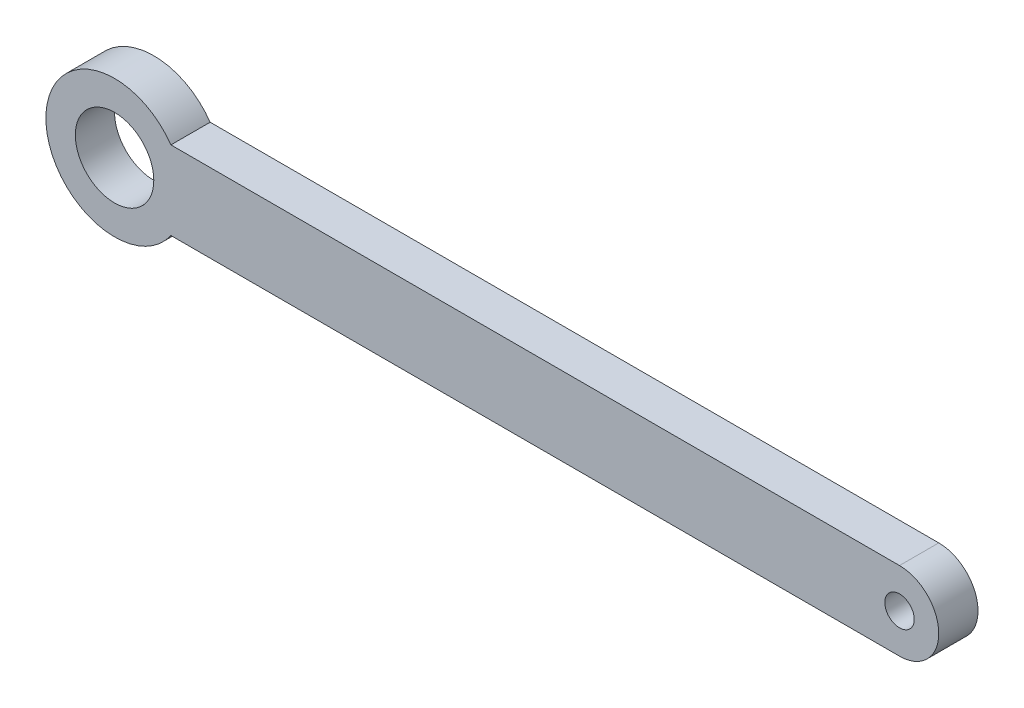
ISO-10303-21;
HEADER;
FILE_DESCRIPTION(('STEP AP214'),'2;1');
FILE_NAME('part.step','',(''),(''),'','','');
FILE_SCHEMA(('AUTOMOTIVE_DESIGN { 1 0 10303 214 1 1 1 1 }'));
ENDSEC;
DATA;
#1=APPLICATION_CONTEXT('core data for automotive mechanical design processes');
#2=APPLICATION_PROTOCOL_DEFINITION('international standard','automotive_design',2000,#1);
#3=PRODUCT_CONTEXT('',#1,'mechanical');
#4=PRODUCT('Part','Part','',(#3));
#5=PRODUCT_RELATED_PRODUCT_CATEGORY('part','',(#4));
#6=PRODUCT_DEFINITION_FORMATION('','',#4);
#7=PRODUCT_DEFINITION_CONTEXT('part definition',#1,'design');
#8=PRODUCT_DEFINITION('design','',#6,#7);
#9=PRODUCT_DEFINITION_SHAPE('','',#8);
#10=(LENGTH_UNIT() NAMED_UNIT(*) SI_UNIT(.MILLI.,.METRE.));
#11=(NAMED_UNIT(*) PLANE_ANGLE_UNIT() SI_UNIT($,.RADIAN.));
#12=(NAMED_UNIT(*) SI_UNIT($,.STERADIAN.) SOLID_ANGLE_UNIT());
#13=UNCERTAINTY_MEASURE_WITH_UNIT(LENGTH_MEASURE(1.E-05),#10,'distance_accuracy_value','');
#14=(GEOMETRIC_REPRESENTATION_CONTEXT(3) GLOBAL_UNCERTAINTY_ASSIGNED_CONTEXT((#13)) GLOBAL_UNIT_ASSIGNED_CONTEXT((#10,
#11,#12)) REPRESENTATION_CONTEXT('',''));
#15=CARTESIAN_POINT('',(0.,0.,0.));
#16=DIRECTION('',(0.,0.,1.));
#17=DIRECTION('',(1.,0.,0.));
#18=AXIS2_PLACEMENT_3D('',#15,#16,#17);
#19=CARTESIAN_POINT('',(0.,-2.,2.));
#20=DIRECTION('',(0.,1.,0.));
#21=DIRECTION('',(0.,0.,1.));
#22=AXIS2_PLACEMENT_3D('',#19,#20,#21);
#23=PLANE('',#22);
#24=DIRECTION('',(1.,0.,0.));
#25=VECTOR('',#24,1.);
#26=CARTESIAN_POINT('',(0.,-2.,2.));
#27=LINE('',#26,#25);
#28=CARTESIAN_POINT('',(2.87228132326901,-2.,2.));
#29=VERTEX_POINT('',#28);
#30=CARTESIAN_POINT('',(40.,-2.,2.));
#31=VERTEX_POINT('',#30);
#32=EDGE_CURVE('E70',#29,#31,#27,.T.);
#33=ORIENTED_EDGE('',*,*,#32,.F.);
#34=DIRECTION('',(0.,0.,1.));
#35=VECTOR('',#34,1.);
#36=CARTESIAN_POINT('',(2.87228132326901,-2.,-9.89949493661167));
#37=LINE('',#36,#35);
#38=CARTESIAN_POINT('',(2.87228132326901,-2.,0.));
#39=VERTEX_POINT('',#38);
#40=EDGE_CURVE('E100',#29,#39,#37,.F.);
#41=ORIENTED_EDGE('',*,*,#40,.T.);
#42=DIRECTION('',(1.,0.,0.));
#43=VECTOR('',#42,1.);
#44=CARTESIAN_POINT('',(0.,-2.,0.));
#45=LINE('',#44,#43);
#46=CARTESIAN_POINT('',(40.,-2.,0.));
#47=VERTEX_POINT('',#46);
#48=EDGE_CURVE('E90',#39,#47,#45,.T.);
#49=ORIENTED_EDGE('',*,*,#48,.T.);
#50=DIRECTION('',(0.,0.,-1.));
#51=VECTOR('',#50,1.);
#52=CARTESIAN_POINT('',(40.,-2.,2.));
#53=LINE('',#52,#51);
#54=EDGE_CURVE('E54',#31,#47,#53,.T.);
#55=ORIENTED_EDGE('',*,*,#54,.F.);
#56=EDGE_LOOP('',(#33,#41,#49,#55));
#57=FACE_BOUND('',#56,.T.);
#58=ADVANCED_FACE('F45',(#57),#23,.F.);
#59=CARTESIAN_POINT('',(40.,0.,2.));
#60=DIRECTION('',(0.,0.,-1.));
#61=DIRECTION('',(-1.,0.,0.));
#62=AXIS2_PLACEMENT_3D('',#59,#60,#61);
#63=CYLINDRICAL_SURFACE('',#62,2.);
#64=CARTESIAN_POINT('',(40.,0.,0.));
#65=DIRECTION('',(0.,0.,1.));
#66=DIRECTION('',(1.,0.,0.));
#67=AXIS2_PLACEMENT_3D('',#64,#65,#66);
#68=CIRCLE('',#67,2.);
#69=CARTESIAN_POINT('',(40.,2.,0.));
#70=VERTEX_POINT('',#69);
#71=EDGE_CURVE('E96',#47,#70,#68,.T.);
#72=ORIENTED_EDGE('',*,*,#71,.T.);
#73=DIRECTION('',(0.,0.,-1.));
#74=VECTOR('',#73,1.);
#75=CARTESIAN_POINT('',(40.,2.,2.));
#76=LINE('',#75,#74);
#77=CARTESIAN_POINT('',(40.,2.,2.));
#78=VERTEX_POINT('',#77);
#79=EDGE_CURVE('E131',#78,#70,#76,.T.);
#80=ORIENTED_EDGE('',*,*,#79,.F.);
#81=CARTESIAN_POINT('',(40.,0.,2.));
#82=DIRECTION('',(0.,0.,1.));
#83=DIRECTION('',(1.,0.,0.));
#84=AXIS2_PLACEMENT_3D('',#81,#82,#83);
#85=CIRCLE('',#84,2.);
#86=EDGE_CURVE('E125',#31,#78,#85,.T.);
#87=ORIENTED_EDGE('',*,*,#86,.F.);
#88=ORIENTED_EDGE('',*,*,#54,.T.);
#89=EDGE_LOOP('',(#72,#80,#87,#88));
#90=FACE_BOUND('',#89,.T.);
#91=ADVANCED_FACE('F142',(#90),#63,.T.);
#92=CARTESIAN_POINT('',(0.,2.,2.));
#93=DIRECTION('',(0.,-1.,0.));
#94=DIRECTION('',(0.,0.,-1.));
#95=AXIS2_PLACEMENT_3D('',#92,#93,#94);
#96=PLANE('',#95);
#97=DIRECTION('',(-1.,0.,0.));
#98=VECTOR('',#97,1.);
#99=CARTESIAN_POINT('',(0.,2.,0.));
#100=LINE('',#99,#98);
#101=CARTESIAN_POINT('',(2.87228132326901,2.,0.));
#102=VERTEX_POINT('',#101);
#103=EDGE_CURVE('E126',#70,#102,#100,.T.);
#104=ORIENTED_EDGE('',*,*,#103,.T.);
#105=DIRECTION('',(0.,0.,1.));
#106=VECTOR('',#105,1.);
#107=CARTESIAN_POINT('',(2.87228132326901,2.,-9.89949493661167));
#108=LINE('',#107,#106);
#109=CARTESIAN_POINT('',(2.87228132326901,2.,2.));
#110=VERTEX_POINT('',#109);
#111=EDGE_CURVE('E62',#102,#110,#108,.T.);
#112=ORIENTED_EDGE('',*,*,#111,.T.);
#113=DIRECTION('',(-1.,0.,0.));
#114=VECTOR('',#113,1.);
#115=CARTESIAN_POINT('',(0.,2.,2.));
#116=LINE('',#115,#114);
#117=EDGE_CURVE('E129',#78,#110,#116,.T.);
#118=ORIENTED_EDGE('',*,*,#117,.F.);
#119=ORIENTED_EDGE('',*,*,#79,.T.);
#120=EDGE_LOOP('',(#104,#112,#118,#119));
#121=FACE_BOUND('',#120,.T.);
#122=ADVANCED_FACE('F147',(#121),#96,.F.);
#123=CARTESIAN_POINT('',(0.,0.,2.));
#124=DIRECTION('',(0.,0.,1.));
#125=DIRECTION('',(1.,0.,0.));
#126=AXIS2_PLACEMENT_3D('',#123,#124,#125);
#127=PLANE('',#126);
#128=CARTESIAN_POINT('',(0.,0.,2.));
#129=DIRECTION('',(0.,0.,1.));
#130=DIRECTION('',(1.,0.,0.));
#131=AXIS2_PLACEMENT_3D('',#128,#129,#130);
#132=CIRCLE('',#131,3.5);
#133=EDGE_CURVE('E109',#110,#29,#132,.T.);
#134=ORIENTED_EDGE('',*,*,#133,.T.);
#135=ORIENTED_EDGE('',*,*,#32,.T.);
#136=ORIENTED_EDGE('',*,*,#86,.T.);
#137=ORIENTED_EDGE('',*,*,#117,.T.);
#138=EDGE_LOOP('',(#134,#135,#136,#137));
#139=FACE_BOUND('',#138,.T.);
#140=CARTESIAN_POINT('',(0.,0.,2.));
#141=DIRECTION('',(0.,0.,1.));
#142=DIRECTION('',(1.,0.,0.));
#143=AXIS2_PLACEMENT_3D('',#140,#141,#142);
#144=CIRCLE('',#143,2.);
#145=CARTESIAN_POINT('',(2.,0.,2.));
#146=VERTEX_POINT('',#145);
#147=EDGE_CURVE('E11',#146,#146,#144,.T.);
#148=ORIENTED_EDGE('',*,*,#147,.F.);
#149=EDGE_LOOP('',(#148));
#150=FACE_BOUND('',#149,.T.);
#151=CARTESIAN_POINT('',(40.,0.,2.));
#152=DIRECTION('',(0.,0.,1.));
#153=DIRECTION('',(1.,0.,0.));
#154=AXIS2_PLACEMENT_3D('',#151,#152,#153);
#155=CIRCLE('',#154,0.749999999999999);
#156=CARTESIAN_POINT('',(40.75,0.,2.));
#157=VERTEX_POINT('',#156);
#158=EDGE_CURVE('E119',#157,#157,#155,.T.);
#159=ORIENTED_EDGE('',*,*,#158,.F.);
#160=EDGE_LOOP('',(#159));
#161=FACE_BOUND('',#160,.T.);
#162=ADVANCED_FACE('F145',(#139,#150,#161),#127,.T.);
#163=CARTESIAN_POINT('',(0.,0.,0.));
#164=DIRECTION('',(0.,0.,1.));
#165=DIRECTION('',(1.,0.,0.));
#166=AXIS2_PLACEMENT_3D('',#163,#164,#165);
#167=PLANE('',#166);
#168=ORIENTED_EDGE('',*,*,#48,.F.);
#169=CARTESIAN_POINT('',(0.,0.,0.));
#170=DIRECTION('',(0.,0.,1.));
#171=DIRECTION('',(1.,0.,0.));
#172=AXIS2_PLACEMENT_3D('',#169,#170,#171);
#173=CIRCLE('',#172,3.5);
#174=EDGE_CURVE('E95',#39,#102,#173,.F.);
#175=ORIENTED_EDGE('',*,*,#174,.T.);
#176=ORIENTED_EDGE('',*,*,#103,.F.);
#177=ORIENTED_EDGE('',*,*,#71,.F.);
#178=EDGE_LOOP('',(#168,#175,#176,#177));
#179=FACE_BOUND('',#178,.T.);
#180=CARTESIAN_POINT('',(40.,0.,0.));
#181=DIRECTION('',(0.,0.,1.));
#182=DIRECTION('',(1.,0.,0.));
#183=AXIS2_PLACEMENT_3D('',#180,#181,#182);
#184=CIRCLE('',#183,0.749999999999999);
#185=CARTESIAN_POINT('',(40.75,0.,0.));
#186=VERTEX_POINT('',#185);
#187=EDGE_CURVE('E48',#186,#186,#184,.T.);
#188=ORIENTED_EDGE('',*,*,#187,.T.);
#189=EDGE_LOOP('',(#188));
#190=FACE_BOUND('',#189,.T.);
#191=CARTESIAN_POINT('',(0.,0.,0.));
#192=DIRECTION('',(0.,0.,1.));
#193=DIRECTION('',(1.,0.,0.));
#194=AXIS2_PLACEMENT_3D('',#191,#192,#193);
#195=CIRCLE('',#194,2.);
#196=CARTESIAN_POINT('',(2.,0.,0.));
#197=VERTEX_POINT('',#196);
#198=EDGE_CURVE('E105',#197,#197,#195,.T.);
#199=ORIENTED_EDGE('',*,*,#198,.T.);
#200=EDGE_LOOP('',(#199));
#201=FACE_BOUND('',#200,.T.);
#202=ADVANCED_FACE('F91',(#179,#190,#201),#167,.F.);
#203=CARTESIAN_POINT('',(40.,0.,-8.));
#204=DIRECTION('',(0.,0.,1.));
#205=DIRECTION('',(1.,0.,0.));
#206=AXIS2_PLACEMENT_3D('',#203,#204,#205);
#207=CYLINDRICAL_SURFACE('',#206,0.749999999999999);
#208=ORIENTED_EDGE('',*,*,#158,.T.);
#209=EDGE_LOOP('',(#208));
#210=FACE_BOUND('',#209,.T.);
#211=ORIENTED_EDGE('',*,*,#187,.F.);
#212=EDGE_LOOP('',(#211));
#213=FACE_BOUND('',#212,.T.);
#214=ADVANCED_FACE('F164',(#210,#213),#207,.F.);
#215=CARTESIAN_POINT('',(0.,0.,-6.));
#216=DIRECTION('',(0.,0.,1.));
#217=DIRECTION('',(1.,0.,0.));
#218=AXIS2_PLACEMENT_3D('',#215,#216,#217);
#219=CYLINDRICAL_SURFACE('',#218,2.);
#220=ORIENTED_EDGE('',*,*,#198,.F.);
#221=EDGE_LOOP('',(#220));
#222=FACE_BOUND('',#221,.T.);
#223=ORIENTED_EDGE('',*,*,#147,.T.);
#224=EDGE_LOOP('',(#223));
#225=FACE_BOUND('',#224,.T.);
#226=ADVANCED_FACE('F167',(#222,#225),#219,.F.);
#227=CARTESIAN_POINT('',(0.,0.,-9.89949493661167));
#228=DIRECTION('',(0.,0.,1.));
#229=DIRECTION('',(1.,0.,0.));
#230=AXIS2_PLACEMENT_3D('',#227,#228,#229);
#231=CYLINDRICAL_SURFACE('',#230,3.5);
#232=ORIENTED_EDGE('',*,*,#40,.F.);
#233=ORIENTED_EDGE('',*,*,#133,.F.);
#234=ORIENTED_EDGE('',*,*,#111,.F.);
#235=ORIENTED_EDGE('',*,*,#174,.F.);
#236=EDGE_LOOP('',(#232,#233,#234,#235));
#237=FACE_BOUND('',#236,.T.);
#238=ADVANCED_FACE('F107',(#237),#231,.T.);
#239=CLOSED_SHELL('',(#58,#91,#122,#162,#202,#214,#226,#238));
#240=MANIFOLD_SOLID_BREP('B2',#239);
#241=ADVANCED_BREP_SHAPE_REPRESENTATION('',(#18,#240),#14);
#242=SHAPE_DEFINITION_REPRESENTATION(#9,#241);
ENDSEC;
END-ISO-10303-21;
